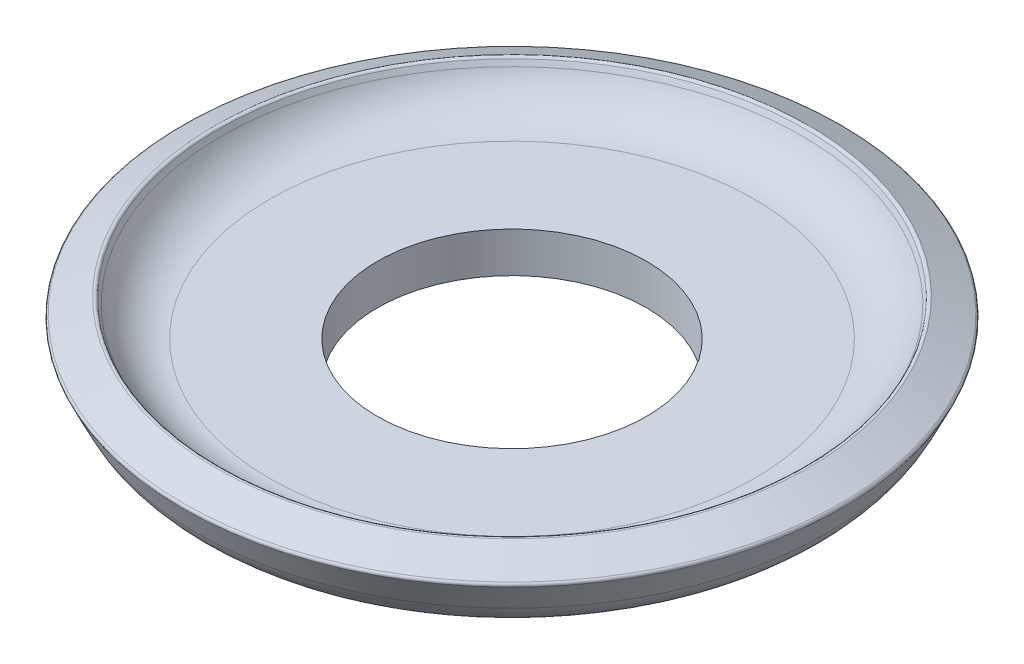
ISO-10303-21;
HEADER;
FILE_DESCRIPTION(('STEP AP214'),'2;1');
FILE_NAME('part.step','',(''),(''),'','','');
FILE_SCHEMA(('AUTOMOTIVE_DESIGN { 1 0 10303 214 1 1 1 1 }'));
ENDSEC;
DATA;
#1=APPLICATION_CONTEXT('core data for automotive mechanical design processes');
#2=APPLICATION_PROTOCOL_DEFINITION('international standard','automotive_design',2000,#1);
#3=PRODUCT_CONTEXT('',#1,'mechanical');
#4=PRODUCT('Part','Part','',(#3));
#5=PRODUCT_RELATED_PRODUCT_CATEGORY('part','',(#4));
#6=PRODUCT_DEFINITION_FORMATION('','',#4);
#7=PRODUCT_DEFINITION_CONTEXT('part definition',#1,'design');
#8=PRODUCT_DEFINITION('design','',#6,#7);
#9=PRODUCT_DEFINITION_SHAPE('','',#8);
#10=(LENGTH_UNIT() NAMED_UNIT(*) SI_UNIT(.MILLI.,.METRE.));
#11=(NAMED_UNIT(*) PLANE_ANGLE_UNIT() SI_UNIT($,.RADIAN.));
#12=(NAMED_UNIT(*) SI_UNIT($,.STERADIAN.) SOLID_ANGLE_UNIT());
#13=UNCERTAINTY_MEASURE_WITH_UNIT(LENGTH_MEASURE(1.E-05),#10,'distance_accuracy_value','');
#14=(GEOMETRIC_REPRESENTATION_CONTEXT(3) GLOBAL_UNCERTAINTY_ASSIGNED_CONTEXT((#13)) GLOBAL_UNIT_ASSIGNED_CONTEXT((#10,
#11,#12)) REPRESENTATION_CONTEXT('',''));
#15=CARTESIAN_POINT('',(0.,0.,0.));
#16=DIRECTION('',(0.,0.,1.));
#17=DIRECTION('',(1.,0.,0.));
#18=AXIS2_PLACEMENT_3D('',#15,#16,#17);
#19=CARTESIAN_POINT('',(0.,4.37115044906022,0.));
#20=DIRECTION('',(0.,1.,0.));
#21=DIRECTION('',(0.,0.,1.));
#22=AXIS2_PLACEMENT_3D('',#19,#20,#21);
#23=CYLINDRICAL_SURFACE('',#22,5.);
#24=CARTESIAN_POINT('',(0.,1.17640611567636,0.));
#25=DIRECTION('',(0.,1.,0.));
#26=DIRECTION('',(0.,0.,1.));
#27=AXIS2_PLACEMENT_3D('',#24,#25,#26);
#28=CIRCLE('',#27,5.);
#29=CARTESIAN_POINT('',(0.,1.17640611567636,5.));
#30=VERTEX_POINT('',#29);
#31=EDGE_CURVE('E10',#30,#30,#28,.T.);
#32=ORIENTED_EDGE('',*,*,#31,.F.);
#33=EDGE_LOOP('',(#32));
#34=FACE_BOUND('',#33,.T.);
#35=CARTESIAN_POINT('',(0.,2.67640611567636,0.));
#36=DIRECTION('',(0.,1.,0.));
#37=DIRECTION('',(0.,0.,1.));
#38=AXIS2_PLACEMENT_3D('',#35,#36,#37);
#39=CIRCLE('',#38,5.);
#40=CARTESIAN_POINT('',(0.,2.67640611567636,5.));
#41=VERTEX_POINT('',#40);
#42=EDGE_CURVE('E67',#41,#41,#39,.T.);
#43=ORIENTED_EDGE('',*,*,#42,.T.);
#44=EDGE_LOOP('',(#43));
#45=FACE_BOUND('',#44,.T.);
#46=ADVANCED_FACE('F33',(#34,#45),#23,.F.);
#47=CARTESIAN_POINT('',(5.,1.17640611567636,0.));
#48=DIRECTION('',(0.,1.,0.));
#49=DIRECTION('',(0.,0.,1.));
#50=AXIS2_PLACEMENT_3D('',#47,#48,#49);
#51=PLANE('',#50);
#52=CARTESIAN_POINT('',(0.,1.17640611567636,0.));
#53=DIRECTION('',(0.,1.,0.));
#54=DIRECTION('',(0.,0.,1.));
#55=AXIS2_PLACEMENT_3D('',#52,#53,#54);
#56=CIRCLE('',#55,9.93722570988627);
#57=CARTESIAN_POINT('',(0.,1.17640611567636,9.93722570988627));
#58=VERTEX_POINT('',#57);
#59=EDGE_CURVE('E39',#58,#58,#56,.T.);
#60=ORIENTED_EDGE('',*,*,#59,.F.);
#61=EDGE_LOOP('',(#60));
#62=FACE_BOUND('',#61,.T.);
#63=ORIENTED_EDGE('',*,*,#31,.T.);
#64=EDGE_LOOP('',(#63));
#65=FACE_BOUND('',#64,.T.);
#66=ADVANCED_FACE('F116',(#62,#65),#51,.F.);
#67=CARTESIAN_POINT('',(0.,3.17640611567636,0.));
#68=DIRECTION('',(0.,1.,0.));
#69=DIRECTION('',(0.,0.,1.));
#70=AXIS2_PLACEMENT_3D('',#67,#68,#69);
#71=TOROIDAL_SURFACE('',#70,9.93722570988628,2.);
#72=CARTESIAN_POINT('',(0.,2.3014199158945,0.));
#73=DIRECTION('',(0.,1.,0.));
#74=DIRECTION('',(0.,0.,1.));
#75=AXIS2_PLACEMENT_3D('',#72,#73,#74);
#76=CIRCLE('',#75,11.7356692453333);
#77=CARTESIAN_POINT('',(0.,2.3014199158945,11.7356692453333));
#78=VERTEX_POINT('',#77);
#79=EDGE_CURVE('E43',#78,#78,#76,.T.);
#80=ORIENTED_EDGE('',*,*,#79,.F.);
#81=EDGE_LOOP('',(#80));
#82=FACE_BOUND('',#81,.T.);
#83=ORIENTED_EDGE('',*,*,#59,.T.);
#84=EDGE_LOOP('',(#83));
#85=FACE_BOUND('',#84,.T.);
#86=ADVANCED_FACE('F111',(#82,#85),#71,.T.);
#87=CARTESIAN_POINT('',(0.,2.3014199158945,0.));
#88=DIRECTION('',(0.,1.,0.));
#89=DIRECTION('',(0.,0.,1.));
#90=AXIS2_PLACEMENT_3D('',#87,#88,#89);
#91=CONICAL_SURFACE('',#90,11.7356692453333,0.452808921307522);
#92=CARTESIAN_POINT('',(0.,3.33453835821282,0.));
#93=DIRECTION('',(0.,1.,0.));
#94=DIRECTION('',(0.,0.,1.));
#95=AXIS2_PLACEMENT_3D('',#92,#93,#94);
#96=CIRCLE('',#95,12.2383063100794);
#97=CARTESIAN_POINT('',(0.,3.33453835821282,12.2383063100794));
#98=VERTEX_POINT('',#97);
#99=EDGE_CURVE('E47',#98,#98,#96,.T.);
#100=ORIENTED_EDGE('',*,*,#99,.F.);
#101=EDGE_LOOP('',(#100));
#102=FACE_BOUND('',#101,.T.);
#103=ORIENTED_EDGE('',*,*,#79,.T.);
#104=EDGE_LOOP('',(#103));
#105=FACE_BOUND('',#104,.T.);
#106=ADVANCED_FACE('F105',(#102,#105),#91,.T.);
#107=CARTESIAN_POINT('',(0.,3.37828766820191,0.));
#108=DIRECTION('',(0.,1.,0.));
#109=DIRECTION('',(0.,0.,1.));
#110=AXIS2_PLACEMENT_3D('',#107,#108,#109);
#111=TOROIDAL_SURFACE('',#110,12.1483841333071,0.0999999999999996);
#112=CARTESIAN_POINT('',(0.,3.46820984497427,0.));
#113=DIRECTION('',(0.,1.,0.));
#114=DIRECTION('',(0.,0.,1.));
#115=AXIS2_PLACEMENT_3D('',#112,#113,#114);
#116=CIRCLE('',#115,12.1921334432962);
#117=CARTESIAN_POINT('',(0.,3.46820984497427,12.1921334432962));
#118=VERTEX_POINT('',#117);
#119=EDGE_CURVE('E52',#118,#118,#116,.T.);
#120=ORIENTED_EDGE('',*,*,#119,.F.);
#121=EDGE_LOOP('',(#120));
#122=FACE_BOUND('',#121,.T.);
#123=ORIENTED_EDGE('',*,*,#99,.T.);
#124=EDGE_LOOP('',(#123));
#125=FACE_BOUND('',#124,.T.);
#126=ADVANCED_FACE('F99',(#122,#125),#111,.T.);
#127=CARTESIAN_POINT('',(0.,3.46820984497427,0.));
#128=DIRECTION('',(0.,-1.,0.));
#129=DIRECTION('',(0.,0.,-1.));
#130=AXIS2_PLACEMENT_3D('',#127,#128,#129);
#131=CONICAL_SURFACE('',#130,12.1921334432962,1.11798740548738);
#132=CARTESIAN_POINT('',(0.,4.03695087483248,0.));
#133=DIRECTION('',(0.,1.,0.));
#134=DIRECTION('',(0.,0.,1.));
#135=AXIS2_PLACEMENT_3D('',#132,#133,#134);
#136=CIRCLE('',#135,11.0231451452556);
#137=CARTESIAN_POINT('',(0.,4.03695087483248,11.0231451452556));
#138=VERTEX_POINT('',#137);
#139=EDGE_CURVE('E55',#138,#138,#136,.T.);
#140=ORIENTED_EDGE('',*,*,#139,.F.);
#141=EDGE_LOOP('',(#140));
#142=FACE_BOUND('',#141,.T.);
#143=ORIENTED_EDGE('',*,*,#119,.T.);
#144=EDGE_LOOP('',(#143));
#145=FACE_BOUND('',#144,.T.);
#146=ADVANCED_FACE('F93',(#142,#145),#131,.T.);
#147=CARTESIAN_POINT('',(0.,3.94702869806013,0.));
#148=DIRECTION('',(0.,1.,0.));
#149=DIRECTION('',(0.,0.,1.));
#150=AXIS2_PLACEMENT_3D('',#147,#148,#149);
#151=TOROIDAL_SURFACE('',#150,10.9793958352665,0.0999999999999992);
#152=CARTESIAN_POINT('',(0.,3.99077800804922,0.));
#153=DIRECTION('',(0.,1.,0.));
#154=DIRECTION('',(0.,0.,1.));
#155=AXIS2_PLACEMENT_3D('',#152,#153,#154);
#156=CIRCLE('',#155,10.8894736584941);
#157=CARTESIAN_POINT('',(0.,3.99077800804922,10.8894736584941));
#158=VERTEX_POINT('',#157);
#159=EDGE_CURVE('E58',#158,#158,#156,.T.);
#160=ORIENTED_EDGE('',*,*,#159,.F.);
#161=EDGE_LOOP('',(#160));
#162=FACE_BOUND('',#161,.T.);
#163=ORIENTED_EDGE('',*,*,#139,.T.);
#164=EDGE_LOOP('',(#163));
#165=FACE_BOUND('',#164,.T.);
#166=ADVANCED_FACE('F87',(#162,#165),#151,.T.);
#167=CARTESIAN_POINT('',(0.,3.99077800804922,0.));
#168=DIRECTION('',(0.,1.,0.));
#169=DIRECTION('',(0.,0.,1.));
#170=AXIS2_PLACEMENT_3D('',#167,#168,#169);
#171=CONICAL_SURFACE('',#170,10.8894736584941,0.452808921307517);
#172=CARTESIAN_POINT('',(0.,3.80141991589449,0.));
#173=DIRECTION('',(0.,1.,0.));
#174=DIRECTION('',(0.,0.,1.));
#175=AXIS2_PLACEMENT_3D('',#172,#173,#174);
#176=CIRCLE('',#175,10.7973463749922);
#177=CARTESIAN_POINT('',(0.,3.80141991589449,10.7973463749922));
#178=VERTEX_POINT('',#177);
#179=EDGE_CURVE('E61',#178,#178,#176,.T.);
#180=ORIENTED_EDGE('',*,*,#179,.F.);
#181=EDGE_LOOP('',(#180));
#182=FACE_BOUND('',#181,.T.);
#183=ORIENTED_EDGE('',*,*,#159,.T.);
#184=EDGE_LOOP('',(#183));
#185=FACE_BOUND('',#184,.T.);
#186=ADVANCED_FACE('F81',(#182,#185),#171,.F.);
#187=CARTESIAN_POINT('',(0.,4.67640611567636,0.));
#188=DIRECTION('',(0.,1.,0.));
#189=DIRECTION('',(0.,0.,1.));
#190=AXIS2_PLACEMENT_3D('',#187,#188,#189);
#191=TOROIDAL_SURFACE('',#190,8.99890283954511,2.);
#192=CARTESIAN_POINT('',(0.,2.67640611567636,0.));
#193=DIRECTION('',(0.,1.,0.));
#194=DIRECTION('',(0.,0.,1.));
#195=AXIS2_PLACEMENT_3D('',#192,#193,#194);
#196=CIRCLE('',#195,8.99890283954511);
#197=CARTESIAN_POINT('',(0.,2.67640611567636,8.99890283954511));
#198=VERTEX_POINT('',#197);
#199=EDGE_CURVE('E64',#198,#198,#196,.T.);
#200=ORIENTED_EDGE('',*,*,#199,.F.);
#201=EDGE_LOOP('',(#200));
#202=FACE_BOUND('',#201,.T.);
#203=ORIENTED_EDGE('',*,*,#179,.T.);
#204=EDGE_LOOP('',(#203));
#205=FACE_BOUND('',#204,.T.);
#206=ADVANCED_FACE('F75',(#202,#205),#191,.F.);
#207=CARTESIAN_POINT('',(8.99890283954511,2.67640611567636,0.));
#208=DIRECTION('',(0.,-1.,0.));
#209=DIRECTION('',(0.,0.,-1.));
#210=AXIS2_PLACEMENT_3D('',#207,#208,#209);
#211=PLANE('',#210);
#212=ORIENTED_EDGE('',*,*,#42,.F.);
#213=EDGE_LOOP('',(#212));
#214=FACE_BOUND('',#213,.T.);
#215=ORIENTED_EDGE('',*,*,#199,.T.);
#216=EDGE_LOOP('',(#215));
#217=FACE_BOUND('',#216,.T.);
#218=ADVANCED_FACE('F72',(#214,#217),#211,.F.);
#219=CLOSED_SHELL('',(#46,#66,#86,#106,#126,#146,#166,#186,#206,#218));
#220=MANIFOLD_SOLID_BREP('B2',#219);
#221=ADVANCED_BREP_SHAPE_REPRESENTATION('',(#18,#220),#14);
#222=SHAPE_DEFINITION_REPRESENTATION(#9,#221);
ENDSEC;
END-ISO-10303-21;
